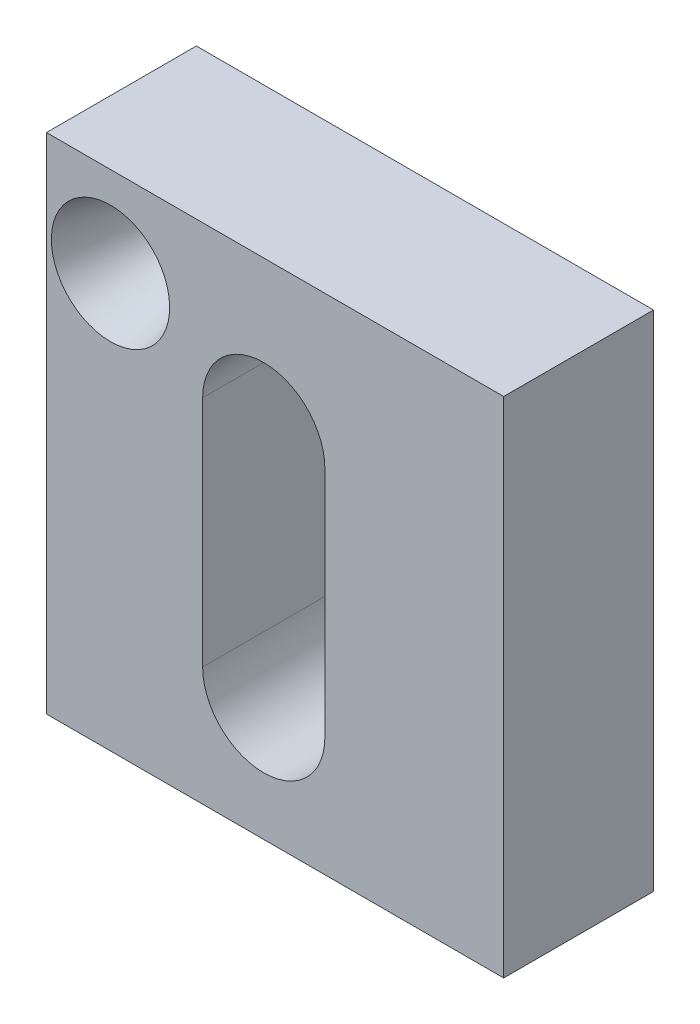
ISO-10303-21;
HEADER;
FILE_DESCRIPTION(('STEP AP214'),'2;1');
FILE_NAME('part.step','',(''),(''),'','','');
FILE_SCHEMA(('AUTOMOTIVE_DESIGN { 1 0 10303 214 1 1 1 1 }'));
ENDSEC;
DATA;
#1=APPLICATION_CONTEXT('core data for automotive mechanical design processes');
#2=APPLICATION_PROTOCOL_DEFINITION('international standard','automotive_design',2000,#1);
#3=PRODUCT_CONTEXT('',#1,'mechanical');
#4=PRODUCT('Part','Part','',(#3));
#5=PRODUCT_RELATED_PRODUCT_CATEGORY('part','',(#4));
#6=PRODUCT_DEFINITION_FORMATION('','',#4);
#7=PRODUCT_DEFINITION_CONTEXT('part definition',#1,'design');
#8=PRODUCT_DEFINITION('design','',#6,#7);
#9=PRODUCT_DEFINITION_SHAPE('','',#8);
#10=(LENGTH_UNIT() NAMED_UNIT(*) SI_UNIT(.MILLI.,.METRE.));
#11=(NAMED_UNIT(*) PLANE_ANGLE_UNIT() SI_UNIT($,.RADIAN.));
#12=(NAMED_UNIT(*) SI_UNIT($,.STERADIAN.) SOLID_ANGLE_UNIT());
#13=UNCERTAINTY_MEASURE_WITH_UNIT(LENGTH_MEASURE(1.E-05),#10,'distance_accuracy_value','');
#14=(GEOMETRIC_REPRESENTATION_CONTEXT(3) GLOBAL_UNCERTAINTY_ASSIGNED_CONTEXT((#13)) GLOBAL_UNIT_ASSIGNED_CONTEXT((#10,
#11,#12)) REPRESENTATION_CONTEXT('',''));
#15=CARTESIAN_POINT('',(0.,0.,0.));
#16=DIRECTION('',(0.,0.,1.));
#17=DIRECTION('',(1.,0.,0.));
#18=AXIS2_PLACEMENT_3D('',#15,#16,#17);
#19=CARTESIAN_POINT('',(0.,0.,12.7));
#20=DIRECTION('',(0.,0.,1.));
#21=DIRECTION('',(1.,0.,0.));
#22=AXIS2_PLACEMENT_3D('',#19,#20,#21);
#23=PLANE('',#22);
#24=CARTESIAN_POINT('',(-8.57347636009235,35.0517977976375,12.7));
#25=DIRECTION('',(0.,0.,1.));
#26=DIRECTION('',(1.,0.,0.));
#27=AXIS2_PLACEMENT_3D('',#24,#25,#26);
#28=CIRCLE('',#27,5.01042056141245);
#29=CARTESIAN_POINT('',(-4.56861090231961,38.0626725654356,12.7));
#30=VERTEX_POINT('',#29);
#31=EDGE_CURVE('E156',#30,#30,#28,.T.);
#32=ORIENTED_EDGE('',*,*,#31,.F.);
#33=EDGE_LOOP('',(#32));
#34=FACE_BOUND('',#33,.T.);
#35=DIRECTION('',(-1.,0.,0.));
#36=VECTOR('',#35,1.);
#37=CARTESIAN_POINT('',(24.7415458131911,42.674371654535,12.7));
#38=LINE('',#37,#36);
#39=CARTESIAN_POINT('',(24.7415458131911,42.674371654535,12.7));
#40=VERTEX_POINT('',#39);
#41=CARTESIAN_POINT('',(-14.0010298012632,42.674371654535,12.7));
#42=VERTEX_POINT('',#41);
#43=EDGE_CURVE('E165',#40,#42,#38,.T.);
#44=ORIENTED_EDGE('',*,*,#43,.T.);
#45=DIRECTION('',(0.,-1.,0.));
#46=VECTOR('',#45,1.);
#47=CARTESIAN_POINT('',(-14.0010298012632,42.674371654535,12.7));
#48=LINE('',#47,#46);
#49=CARTESIAN_POINT('',(-14.0010298012632,0.,12.7));
#50=VERTEX_POINT('',#49);
#51=EDGE_CURVE('E168',#42,#50,#48,.T.);
#52=ORIENTED_EDGE('',*,*,#51,.T.);
#53=DIRECTION('',(1.,0.,0.));
#54=VECTOR('',#53,1.);
#55=CARTESIAN_POINT('',(-14.0010298012632,0.,12.7));
#56=LINE('',#55,#54);
#57=CARTESIAN_POINT('',(24.7415458131911,0.,12.7));
#58=VERTEX_POINT('',#57);
#59=EDGE_CURVE('E171',#50,#58,#56,.T.);
#60=ORIENTED_EDGE('',*,*,#59,.T.);
#61=DIRECTION('',(0.,1.,0.));
#62=VECTOR('',#61,1.);
#63=CARTESIAN_POINT('',(24.7415458131911,0.,12.7));
#64=LINE('',#63,#62);
#65=EDGE_CURVE('E173',#58,#40,#64,.T.);
#66=ORIENTED_EDGE('',*,*,#65,.T.);
#67=EDGE_LOOP('',(#44,#52,#60,#66));
#68=FACE_BOUND('',#67,.T.);
#69=DIRECTION('',(0.,-1.,0.));
#70=VECTOR('',#69,1.);
#71=CARTESIAN_POINT('',(-0.767179715137678,29.8241114259784,12.7));
#72=LINE('',#71,#70);
#73=CARTESIAN_POINT('',(-0.767179715137678,29.8241114259784,12.7));
#74=VERTEX_POINT('',#73);
#75=CARTESIAN_POINT('',(-0.767179715137678,10.0692337611824,12.7));
#76=VERTEX_POINT('',#75);
#77=EDGE_CURVE('E136',#74,#76,#72,.T.);
#78=ORIENTED_EDGE('',*,*,#77,.F.);
#79=CARTESIAN_POINT('',(4.41128336204183,29.8241114259784,12.7));
#80=DIRECTION('',(0.,0.,1.));
#81=DIRECTION('',(1.,0.,0.));
#82=AXIS2_PLACEMENT_3D('',#79,#80,#81);
#83=CIRCLE('',#82,5.17846307717951);
#84=CARTESIAN_POINT('',(9.58974643922134,29.8241114259784,12.7));
#85=VERTEX_POINT('',#84);
#86=EDGE_CURVE('E128',#85,#74,#83,.T.);
#87=ORIENTED_EDGE('',*,*,#86,.F.);
#88=DIRECTION('',(0.,-1.,0.));
#89=VECTOR('',#88,1.);
#90=CARTESIAN_POINT('',(9.58974643922134,29.8241114259784,12.7));
#91=LINE('',#90,#89);
#92=CARTESIAN_POINT('',(9.58974643922134,10.0692337611824,12.7));
#93=VERTEX_POINT('',#92);
#94=EDGE_CURVE('E150',#85,#93,#91,.T.);
#95=ORIENTED_EDGE('',*,*,#94,.T.);
#96=CARTESIAN_POINT('',(4.41128336204183,10.0692337611824,12.7));
#97=DIRECTION('',(0.,0.,1.));
#98=DIRECTION('',(1.,0.,0.));
#99=AXIS2_PLACEMENT_3D('',#96,#97,#98);
#100=CIRCLE('',#99,5.17846307717951);
#101=EDGE_CURVE('E148',#76,#93,#100,.T.);
#102=ORIENTED_EDGE('',*,*,#101,.F.);
#103=EDGE_LOOP('',(#78,#87,#95,#102));
#104=FACE_BOUND('',#103,.T.);
#105=ADVANCED_FACE('F63',(#34,#68,#104),#23,.T.);
#106=CARTESIAN_POINT('',(0.,0.,0.));
#107=DIRECTION('',(0.,0.,1.));
#108=DIRECTION('',(1.,0.,0.));
#109=AXIS2_PLACEMENT_3D('',#106,#107,#108);
#110=PLANE('',#109);
#111=CARTESIAN_POINT('',(-8.57347636009235,35.0517977976375,0.));
#112=DIRECTION('',(0.,0.,-1.));
#113=DIRECTION('',(-1.,0.,0.));
#114=AXIS2_PLACEMENT_3D('',#111,#112,#113);
#115=CIRCLE('',#114,2.21514541236971);
#116=CARTESIAN_POINT('',(-6.38873586389041,35.4175547691334,0.));
#117=VERTEX_POINT('',#116);
#118=EDGE_CURVE('E260',#117,#117,#115,.T.);
#119=ORIENTED_EDGE('',*,*,#118,.F.);
#120=EDGE_LOOP('',(#119));
#121=FACE_BOUND('',#120,.T.);
#122=DIRECTION('',(-1.,0.,0.));
#123=VECTOR('',#122,1.);
#124=CARTESIAN_POINT('',(24.7415458131911,42.674371654535,0.));
#125=LINE('',#124,#123);
#126=CARTESIAN_POINT('',(24.7415458131911,42.674371654535,0.));
#127=VERTEX_POINT('',#126);
#128=CARTESIAN_POINT('',(-14.0010298012632,42.674371654535,0.));
#129=VERTEX_POINT('',#128);
#130=EDGE_CURVE('E144',#127,#129,#125,.T.);
#131=ORIENTED_EDGE('',*,*,#130,.F.);
#132=DIRECTION('',(0.,1.,0.));
#133=VECTOR('',#132,1.);
#134=CARTESIAN_POINT('',(24.7415458131911,0.,0.));
#135=LINE('',#134,#133);
#136=CARTESIAN_POINT('',(24.7415458131911,0.,0.));
#137=VERTEX_POINT('',#136);
#138=EDGE_CURVE('E169',#137,#127,#135,.T.);
#139=ORIENTED_EDGE('',*,*,#138,.F.);
#140=DIRECTION('',(1.,0.,0.));
#141=VECTOR('',#140,1.);
#142=CARTESIAN_POINT('',(-14.0010298012632,0.,0.));
#143=LINE('',#142,#141);
#144=CARTESIAN_POINT('',(-14.0010298012632,0.,0.));
#145=VERTEX_POINT('',#144);
#146=EDGE_CURVE('E180',#145,#137,#143,.T.);
#147=ORIENTED_EDGE('',*,*,#146,.F.);
#148=DIRECTION('',(0.,-1.,0.));
#149=VECTOR('',#148,1.);
#150=CARTESIAN_POINT('',(-14.0010298012632,42.674371654535,0.));
#151=LINE('',#150,#149);
#152=EDGE_CURVE('E178',#129,#145,#151,.T.);
#153=ORIENTED_EDGE('',*,*,#152,.F.);
#154=EDGE_LOOP('',(#131,#139,#147,#153));
#155=FACE_BOUND('',#154,.T.);
#156=CARTESIAN_POINT('',(4.41128336204183,29.8241114259784,0.));
#157=DIRECTION('',(0.,0.,1.));
#158=DIRECTION('',(1.,0.,0.));
#159=AXIS2_PLACEMENT_3D('',#156,#157,#158);
#160=CIRCLE('',#159,5.17846307717951);
#161=CARTESIAN_POINT('',(9.58974643922134,29.8241114259784,0.));
#162=VERTEX_POINT('',#161);
#163=CARTESIAN_POINT('',(-0.767179715137678,29.8241114259784,0.));
#164=VERTEX_POINT('',#163);
#165=EDGE_CURVE('E86',#162,#164,#160,.T.);
#166=ORIENTED_EDGE('',*,*,#165,.T.);
#167=DIRECTION('',(0.,-1.,0.));
#168=VECTOR('',#167,1.);
#169=CARTESIAN_POINT('',(-0.767179715137678,29.8241114259784,0.));
#170=LINE('',#169,#168);
#171=CARTESIAN_POINT('',(-0.767179715137678,10.0692337611824,0.));
#172=VERTEX_POINT('',#171);
#173=EDGE_CURVE('E143',#164,#172,#170,.T.);
#174=ORIENTED_EDGE('',*,*,#173,.T.);
#175=CARTESIAN_POINT('',(4.41128336204183,10.0692337611824,0.));
#176=DIRECTION('',(0.,0.,1.));
#177=DIRECTION('',(1.,0.,0.));
#178=AXIS2_PLACEMENT_3D('',#175,#176,#177);
#179=CIRCLE('',#178,5.17846307717951);
#180=CARTESIAN_POINT('',(9.58974643922134,10.0692337611824,0.));
#181=VERTEX_POINT('',#180);
#182=EDGE_CURVE('E158',#172,#181,#179,.T.);
#183=ORIENTED_EDGE('',*,*,#182,.T.);
#184=DIRECTION('',(0.,-1.,0.));
#185=VECTOR('',#184,1.);
#186=CARTESIAN_POINT('',(9.58974643922134,29.8241114259784,0.));
#187=LINE('',#186,#185);
#188=EDGE_CURVE('E137',#162,#181,#187,.T.);
#189=ORIENTED_EDGE('',*,*,#188,.F.);
#190=EDGE_LOOP('',(#166,#174,#183,#189));
#191=FACE_BOUND('',#190,.T.);
#192=ADVANCED_FACE('F198',(#121,#155,#191),#110,.F.);
#193=CARTESIAN_POINT('',(24.7415458131911,42.674371654535,12.7));
#194=DIRECTION('',(0.,-1.,0.));
#195=DIRECTION('',(0.,0.,-1.));
#196=AXIS2_PLACEMENT_3D('',#193,#194,#195);
#197=PLANE('',#196);
#198=ORIENTED_EDGE('',*,*,#130,.T.);
#199=DIRECTION('',(0.,0.,-1.));
#200=VECTOR('',#199,1.);
#201=CARTESIAN_POINT('',(-14.0010298012632,42.674371654535,12.7));
#202=LINE('',#201,#200);
#203=EDGE_CURVE('E12',#42,#129,#202,.T.);
#204=ORIENTED_EDGE('',*,*,#203,.F.);
#205=ORIENTED_EDGE('',*,*,#43,.F.);
#206=DIRECTION('',(0.,0.,-1.));
#207=VECTOR('',#206,1.);
#208=CARTESIAN_POINT('',(24.7415458131911,42.674371654535,12.7));
#209=LINE('',#208,#207);
#210=EDGE_CURVE('E175',#40,#127,#209,.T.);
#211=ORIENTED_EDGE('',*,*,#210,.T.);
#212=EDGE_LOOP('',(#198,#204,#205,#211));
#213=FACE_BOUND('',#212,.T.);
#214=ADVANCED_FACE('F65',(#213),#197,.F.);
#215=CARTESIAN_POINT('',(-14.0010298012632,42.674371654535,12.7));
#216=DIRECTION('',(1.,0.,0.));
#217=DIRECTION('',(0.,0.,-1.));
#218=AXIS2_PLACEMENT_3D('',#215,#216,#217);
#219=PLANE('',#218);
#220=ORIENTED_EDGE('',*,*,#152,.T.);
#221=DIRECTION('',(0.,0.,-1.));
#222=VECTOR('',#221,1.);
#223=CARTESIAN_POINT('',(-14.0010298012632,0.,12.7));
#224=LINE('',#223,#222);
#225=EDGE_CURVE('E71',#50,#145,#224,.T.);
#226=ORIENTED_EDGE('',*,*,#225,.F.);
#227=ORIENTED_EDGE('',*,*,#51,.F.);
#228=ORIENTED_EDGE('',*,*,#203,.T.);
#229=EDGE_LOOP('',(#220,#226,#227,#228));
#230=FACE_BOUND('',#229,.T.);
#231=ADVANCED_FACE('F208',(#230),#219,.F.);
#232=CARTESIAN_POINT('',(-14.0010298012632,0.,12.7));
#233=DIRECTION('',(0.,1.,0.));
#234=DIRECTION('',(0.,0.,1.));
#235=AXIS2_PLACEMENT_3D('',#232,#233,#234);
#236=PLANE('',#235);
#237=ORIENTED_EDGE('',*,*,#146,.T.);
#238=DIRECTION('',(0.,0.,-1.));
#239=VECTOR('',#238,1.);
#240=CARTESIAN_POINT('',(24.7415458131911,0.,12.7));
#241=LINE('',#240,#239);
#242=EDGE_CURVE('E185',#58,#137,#241,.T.);
#243=ORIENTED_EDGE('',*,*,#242,.F.);
#244=ORIENTED_EDGE('',*,*,#59,.F.);
#245=ORIENTED_EDGE('',*,*,#225,.T.);
#246=EDGE_LOOP('',(#237,#243,#244,#245));
#247=FACE_BOUND('',#246,.T.);
#248=ADVANCED_FACE('F192',(#247),#236,.F.);
#249=CARTESIAN_POINT('',(24.7415458131911,0.,12.7));
#250=DIRECTION('',(-1.,0.,0.));
#251=DIRECTION('',(0.,0.,1.));
#252=AXIS2_PLACEMENT_3D('',#249,#250,#251);
#253=PLANE('',#252);
#254=ORIENTED_EDGE('',*,*,#138,.T.);
#255=ORIENTED_EDGE('',*,*,#210,.F.);
#256=ORIENTED_EDGE('',*,*,#65,.F.);
#257=ORIENTED_EDGE('',*,*,#242,.T.);
#258=EDGE_LOOP('',(#254,#255,#256,#257));
#259=FACE_BOUND('',#258,.T.);
#260=ADVANCED_FACE('F202',(#259),#253,.F.);
#261=CARTESIAN_POINT('',(4.41128336204183,29.8241114259784,12.7));
#262=DIRECTION('',(0.,0.,-1.));
#263=DIRECTION('',(-1.,0.,0.));
#264=AXIS2_PLACEMENT_3D('',#261,#262,#263);
#265=CYLINDRICAL_SURFACE('',#264,5.17846307717951);
#266=ORIENTED_EDGE('',*,*,#165,.F.);
#267=DIRECTION('',(0.,0.,-1.));
#268=VECTOR('',#267,1.);
#269=CARTESIAN_POINT('',(9.58974643922134,29.8241114259784,12.7));
#270=LINE('',#269,#268);
#271=EDGE_CURVE('E132',#85,#162,#270,.T.);
#272=ORIENTED_EDGE('',*,*,#271,.F.);
#273=ORIENTED_EDGE('',*,*,#86,.T.);
#274=DIRECTION('',(0.,0.,-1.));
#275=VECTOR('',#274,1.);
#276=CARTESIAN_POINT('',(-0.767179715137678,29.8241114259784,12.7));
#277=LINE('',#276,#275);
#278=EDGE_CURVE('E131',#74,#164,#277,.T.);
#279=ORIENTED_EDGE('',*,*,#278,.T.);
#280=EDGE_LOOP('',(#266,#272,#273,#279));
#281=FACE_BOUND('',#280,.T.);
#282=ADVANCED_FACE('F130',(#281),#265,.F.);
#283=CARTESIAN_POINT('',(-0.767179715137678,29.8241114259784,12.7));
#284=DIRECTION('',(1.,0.,0.));
#285=DIRECTION('',(0.,0.,-1.));
#286=AXIS2_PLACEMENT_3D('',#283,#284,#285);
#287=PLANE('',#286);
#288=ORIENTED_EDGE('',*,*,#173,.F.);
#289=ORIENTED_EDGE('',*,*,#278,.F.);
#290=ORIENTED_EDGE('',*,*,#77,.T.);
#291=DIRECTION('',(0.,0.,-1.));
#292=VECTOR('',#291,1.);
#293=CARTESIAN_POINT('',(-0.767179715137678,10.0692337611824,12.7));
#294=LINE('',#293,#292);
#295=EDGE_CURVE('E145',#76,#172,#294,.T.);
#296=ORIENTED_EDGE('',*,*,#295,.T.);
#297=EDGE_LOOP('',(#288,#289,#290,#296));
#298=FACE_BOUND('',#297,.T.);
#299=ADVANCED_FACE('F140',(#298),#287,.T.);
#300=CARTESIAN_POINT('',(4.41128336204183,10.0692337611824,12.7));
#301=DIRECTION('',(0.,0.,-1.));
#302=DIRECTION('',(-1.,0.,0.));
#303=AXIS2_PLACEMENT_3D('',#300,#301,#302);
#304=CYLINDRICAL_SURFACE('',#303,5.17846307717951);
#305=ORIENTED_EDGE('',*,*,#182,.F.);
#306=ORIENTED_EDGE('',*,*,#295,.F.);
#307=ORIENTED_EDGE('',*,*,#101,.T.);
#308=DIRECTION('',(0.,0.,-1.));
#309=VECTOR('',#308,1.);
#310=CARTESIAN_POINT('',(9.58974643922134,10.0692337611824,12.7));
#311=LINE('',#310,#309);
#312=EDGE_CURVE('E78',#93,#181,#311,.T.);
#313=ORIENTED_EDGE('',*,*,#312,.T.);
#314=EDGE_LOOP('',(#305,#306,#307,#313));
#315=FACE_BOUND('',#314,.T.);
#316=ADVANCED_FACE('F235',(#315),#304,.F.);
#317=CARTESIAN_POINT('',(9.58974643922134,29.8241114259784,12.7));
#318=DIRECTION('',(1.,0.,0.));
#319=DIRECTION('',(0.,0.,-1.));
#320=AXIS2_PLACEMENT_3D('',#317,#318,#319);
#321=PLANE('',#320);
#322=ORIENTED_EDGE('',*,*,#188,.T.);
#323=ORIENTED_EDGE('',*,*,#312,.F.);
#324=ORIENTED_EDGE('',*,*,#94,.F.);
#325=ORIENTED_EDGE('',*,*,#271,.T.);
#326=EDGE_LOOP('',(#322,#323,#324,#325));
#327=FACE_BOUND('',#326,.T.);
#328=ADVANCED_FACE('F239',(#327),#321,.F.);
#329=CARTESIAN_POINT('',(-6.38873586389041,35.4175547691334,0.));
#330=CARTESIAN_POINT('',(-4.56861090231961,38.0626725654356,12.7));
#331=CARTESIAN_POINT('',(-7.12024980688226,39.7870357615373,0.));
#332=CARTESIAN_POINT('',(-10.5903604379159,46.0724034809811,12.7));
#333=CARTESIAN_POINT('',(-11.4897307992861,39.0555218185454,0.));
#334=CARTESIAN_POINT('',(-18.6000913534613,40.0506539453848,12.7));
#335=CARTESIAN_POINT('',(-10.7582168562943,34.6860408261415,0.));
#336=CARTESIAN_POINT('',(-12.5783418178651,32.0409230298393,12.7));
#337=CARTESIAN_POINT('',(-10.0267029133024,30.3165598337377,0.));
#338=CARTESIAN_POINT('',(-6.55659228226883,24.0311921142939,12.7));
#339=CARTESIAN_POINT('',(-5.65722192089855,31.0480737767295,0.));
#340=CARTESIAN_POINT('',(1.45313863327665,30.0529416498901,12.7));
#341=CARTESIAN_POINT('',(-6.38873586389041,35.4175547691334,0.));
#342=CARTESIAN_POINT('',(-4.56861090231961,38.0626725654356,12.7));
#343=(BOUNDED_SURFACE() B_SPLINE_SURFACE(3,1,((#329,#330),(#331,#332),(#333,#334),(#335,#336),
(#337,#338),(#339,#340),(#341,#342)),.UNSPECIFIED.,.T.,.F.,.F.) B_SPLINE_SURFACE_WITH_KNOTS((4,
3,4),(2,2),(0.,0.5,1.),(0.,1.),
.UNSPECIFIED.) GEOMETRIC_REPRESENTATION_ITEM() RATIONAL_B_SPLINE_SURFACE(((1.,1.),
(0.333333333333333,0.333333333333333),(0.333333333333333,0.333333333333333),(1.,1.),
(0.333333333333334,0.333333333333333),(0.333333333333334,0.333333333333333),(1.,1.))) REPRESENTATION_ITEM('') SURFACE());
#344=CARTESIAN_POINT('',(-6.38873586389041,35.4175547691334,0.));
#345=CARTESIAN_POINT('',(-6.36977622887404,35.4451080795116,0.132291666666666));
#346=CARTESIAN_POINT('',(-6.35081659385768,35.4726613898897,0.264583333333333));
#347=CARTESIAN_POINT('',(-6.31289732382495,35.527768010646,0.529166666666667));
#348=CARTESIAN_POINT('',(-6.29393768880859,35.5553213210241,0.661458333333333));
#349=CARTESIAN_POINT('',(-6.25601841877587,35.6104279417804,0.926041666666667));
#350=CARTESIAN_POINT('',(-6.23705878375951,35.6379812521586,1.05833333333333));
#351=CARTESIAN_POINT('',(-6.19913951372678,35.6930878729149,1.32291666666667));
#352=CARTESIAN_POINT('',(-6.18017987871042,35.720641183293,1.45520833333333));
#353=CARTESIAN_POINT('',(-6.14226060867769,35.7757478040493,1.71979166666667));
#354=CARTESIAN_POINT('',(-6.12330097366133,35.8033011144275,1.85208333333333));
#355=CARTESIAN_POINT('',(-6.08538170362861,35.8584077351838,2.11666666666667));
#356=CARTESIAN_POINT('',(-6.06642206861224,35.8859610455619,2.24895833333333));
#357=CARTESIAN_POINT('',(-6.02850279857952,35.9410676663182,2.51354166666667));
#358=CARTESIAN_POINT('',(-6.00954316356315,35.9686209766964,2.64583333333333));
#359=CARTESIAN_POINT('',(-5.97162389353043,36.0237275974527,2.91041666666667));
#360=CARTESIAN_POINT('',(-5.95266425851407,36.0512809078308,3.04270833333333));
#361=CARTESIAN_POINT('',(-5.91474498848134,36.1063875285871,3.30729166666667));
#362=CARTESIAN_POINT('',(-5.89578535346498,36.1339408389652,3.43958333333333));
#363=CARTESIAN_POINT('',(-5.85786608343226,36.1890474597215,3.70416666666667));
#364=CARTESIAN_POINT('',(-5.83890644841589,36.2166007700997,3.83645833333333));
#365=CARTESIAN_POINT('',(-5.80098717838317,36.271707390856,4.10104166666667));
#366=CARTESIAN_POINT('',(-5.78202754336681,36.2992607012341,4.23333333333333));
#367=CARTESIAN_POINT('',(-5.74410827333408,36.3543673219904,4.49791666666667));
#368=CARTESIAN_POINT('',(-5.72514863831772,36.3819206323686,4.63020833333333));
#369=CARTESIAN_POINT('',(-5.68722936828499,36.4370272531249,4.89479166666667));
#370=CARTESIAN_POINT('',(-5.66826973326863,36.464580563503,5.02708333333333));
#371=CARTESIAN_POINT('',(-5.63035046323591,36.5196871842593,5.29166666666667));
#372=CARTESIAN_POINT('',(-5.61139082821954,36.5472404946375,5.42395833333333));
#373=CARTESIAN_POINT('',(-5.57347155818682,36.6023471153938,5.68854166666667));
#374=CARTESIAN_POINT('',(-5.55451192317046,36.6299004257719,5.82083333333333));
#375=CARTESIAN_POINT('',(-5.51659265313773,36.6850070465282,6.08541666666667));
#376=CARTESIAN_POINT('',(-5.49763301812137,36.7125603569064,6.21770833333333));
#377=CARTESIAN_POINT('',(-5.45971374808864,36.7676669776626,6.48229166666667));
#378=CARTESIAN_POINT('',(-5.44075411307228,36.7952202880408,6.61458333333333));
#379=CARTESIAN_POINT('',(-5.40283484303956,36.8503269087971,6.87916666666667));
#380=CARTESIAN_POINT('',(-5.38387520802319,36.8778802191752,7.01145833333333));
#381=CARTESIAN_POINT('',(-5.34595593799047,36.9329868399315,7.27604166666667));
#382=CARTESIAN_POINT('',(-5.32699630297411,36.9605401503097,7.40833333333333));
#383=CARTESIAN_POINT('',(-5.28907703294138,37.015646771066,7.67291666666667));
#384=CARTESIAN_POINT('',(-5.27011739792502,37.0432000814441,7.80520833333333));
#385=CARTESIAN_POINT('',(-5.23219812789229,37.0983067022004,8.06979166666667));
#386=CARTESIAN_POINT('',(-5.21323849287593,37.1258600125786,8.20208333333333));
#387=CARTESIAN_POINT('',(-5.17531922284321,37.1809666333349,8.46666666666667));
#388=CARTESIAN_POINT('',(-5.15635958782684,37.208519943713,8.59895833333333));
#389=CARTESIAN_POINT('',(-5.11844031779412,37.2636265644693,8.86354166666667));
#390=CARTESIAN_POINT('',(-5.09948068277776,37.2911798748475,8.99583333333333));
#391=CARTESIAN_POINT('',(-5.06156141274503,37.3462864956037,9.26041666666666));
#392=CARTESIAN_POINT('',(-5.04260177772867,37.3738398059819,9.39270833333333));
#393=CARTESIAN_POINT('',(-5.00468250769594,37.4289464267382,9.65729166666667));
#394=CARTESIAN_POINT('',(-4.98572287267958,37.4564997371163,9.78958333333333));
#395=CARTESIAN_POINT('',(-4.94780360264686,37.5116063578726,10.0541666666667));
#396=CARTESIAN_POINT('',(-4.92884396763049,37.5391596682508,10.1864583333333));
#397=CARTESIAN_POINT('',(-4.89092469759777,37.5942662890071,10.4510416666667));
#398=CARTESIAN_POINT('',(-4.87196506258141,37.6218195993852,10.5833333333333));
#399=CARTESIAN_POINT('',(-4.83404579254868,37.6769262201415,10.8479166666667));
#400=CARTESIAN_POINT('',(-4.81508615753232,37.7044795305197,10.9802083333333));
#401=CARTESIAN_POINT('',(-4.77716688749959,37.759586151276,11.2447916666667));
#402=CARTESIAN_POINT('',(-4.75820725248323,37.7871394616541,11.3770833333333));
#403=CARTESIAN_POINT('',(-4.72028798245051,37.8422460824104,11.6416666666667));
#404=CARTESIAN_POINT('',(-4.70132834743414,37.8697993927886,11.7739583333333));
#405=CARTESIAN_POINT('',(-4.66340907740142,37.9249060135449,12.0385416666667));
#406=CARTESIAN_POINT('',(-4.64444944238506,37.952459323923,12.1708333333333));
#407=CARTESIAN_POINT('',(-4.60653017235233,38.0075659446793,12.4354166666667));
#408=CARTESIAN_POINT('',(-4.58757053733597,38.0351192550574,12.5677083333333));
#409=CARTESIAN_POINT('',(-4.56861090231961,38.0626725654356,12.7));
#410=B_SPLINE_CURVE_WITH_KNOTS('',3,(#344,#345,#346,#347,#348,#349,#350,#351,#352,#353,#354,
#355,#356,#357,#358,#359,#360,#361,#362,#363,#364,#365,#366,#367,#368,#369,#370,#371,#372,#373,
#374,#375,#376,#377,#378,#379,#380,#381,#382,#383,#384,#385,#386,#387,#388,#389,#390,#391,#392,
#393,#394,#395,#396,#397,#398,#399,#400,#401,#402,#403,#404,#405,#406,#407,#408,#409),
.UNSPECIFIED.,.F.,.F.,(4,2,2,2,2,2,2,2,2,2,2,2,2,2,2,2,2,2,2,2,2,2,2,2,2,2,2,2,2,2,2,2,4),(0.,
0.409362479570044,0.818724959140086,1.22808743871013,1.63744991828017,2.04681239785022,
2.45617487742026,2.8655373569903,3.27489983656035,3.68426231613039,4.09362479570043,
4.50298727527048,4.91234975484052,5.32171223441056,5.7310747139806,6.14043719355065,
6.54979967312069,6.95916215269073,7.36852463226078,7.77788711183082,8.18724959140086,
8.59661207097091,9.00597455054095,9.41533703011099,9.82469950968104,10.2340619892511,
10.6434244688211,11.0527869483912,11.4621494279612,11.8715119075313,12.2808743871013,
12.6902368666713,13.0995993462414),.UNSPECIFIED.);
#411=EDGE_CURVE('BSEAM245',#117,#30,#410,.T.);
#412=ORIENTED_EDGE('',*,*,#118,.T.);
#413=ORIENTED_EDGE('',*,*,#31,.T.);
#414=ORIENTED_EDGE('',*,*,#411,.T.);
#415=ORIENTED_EDGE('',*,*,#411,.F.);
#416=EDGE_LOOP('',(#412,#414,#413,#415));
#417=FACE_BOUND('',#416,.T.);
#418=ADVANCED_FACE('F245',(#417),#343,.F.);
#419=CLOSED_SHELL('',(#105,#192,#214,#231,#248,#260,#282,#299,#316,#328,#418));
#420=MANIFOLD_SOLID_BREP('B2',#419);
#421=ADVANCED_BREP_SHAPE_REPRESENTATION('',(#18,#420),#14);
#422=SHAPE_DEFINITION_REPRESENTATION(#9,#421);
ENDSEC;
END-ISO-10303-21;
